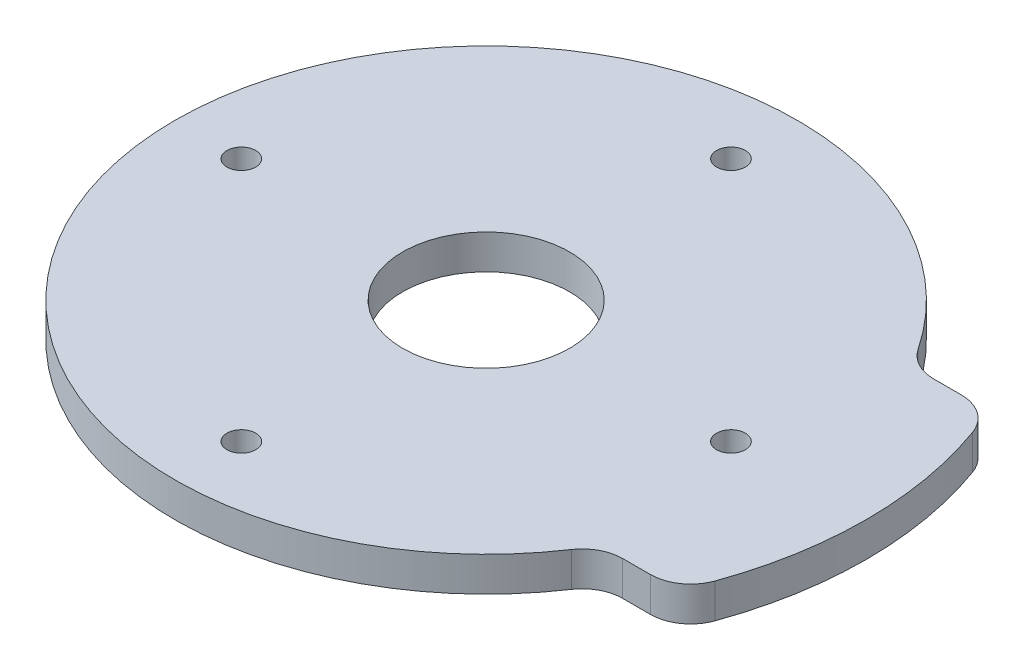
ISO-10303-21;
HEADER;
FILE_DESCRIPTION(('STEP AP214'),'2;1');
FILE_NAME('part.step','',(''),(''),'','','');
FILE_SCHEMA(('AUTOMOTIVE_DESIGN { 1 0 10303 214 1 1 1 1 }'));
ENDSEC;
DATA;
#1=APPLICATION_CONTEXT('core data for automotive mechanical design processes');
#2=APPLICATION_PROTOCOL_DEFINITION('international standard','automotive_design',2000,#1);
#3=PRODUCT_CONTEXT('',#1,'mechanical');
#4=PRODUCT('Part','Part','',(#3));
#5=PRODUCT_RELATED_PRODUCT_CATEGORY('part','',(#4));
#6=PRODUCT_DEFINITION_FORMATION('','',#4);
#7=PRODUCT_DEFINITION_CONTEXT('part definition',#1,'design');
#8=PRODUCT_DEFINITION('design','',#6,#7);
#9=PRODUCT_DEFINITION_SHAPE('','',#8);
#10=(LENGTH_UNIT() NAMED_UNIT(*) SI_UNIT(.MILLI.,.METRE.));
#11=(NAMED_UNIT(*) PLANE_ANGLE_UNIT() SI_UNIT($,.RADIAN.));
#12=(NAMED_UNIT(*) SI_UNIT($,.STERADIAN.) SOLID_ANGLE_UNIT());
#13=UNCERTAINTY_MEASURE_WITH_UNIT(LENGTH_MEASURE(1.E-05),#10,'distance_accuracy_value','');
#14=(GEOMETRIC_REPRESENTATION_CONTEXT(3) GLOBAL_UNCERTAINTY_ASSIGNED_CONTEXT((#13)) GLOBAL_UNIT_ASSIGNED_CONTEXT((#10,
#11,#12)) REPRESENTATION_CONTEXT('',''));
#15=CARTESIAN_POINT('',(0.,0.,0.));
#16=DIRECTION('',(0.,0.,1.));
#17=DIRECTION('',(1.,0.,0.));
#18=AXIS2_PLACEMENT_3D('',#15,#16,#17);
#19=CARTESIAN_POINT('',(0.,6.,0.));
#20=DIRECTION('',(0.,1.,0.));
#21=DIRECTION('',(0.,0.,1.));
#22=AXIS2_PLACEMENT_3D('',#19,#20,#21);
#23=PLANE('',#22);
#24=CARTESIAN_POINT('',(42.5,6.,0.));
#25=DIRECTION('',(0.,1.,0.));
#26=DIRECTION('',(0.,0.,1.));
#27=AXIS2_PLACEMENT_3D('',#24,#25,#26);
#28=CIRCLE('',#27,2.5);
#29=CARTESIAN_POINT('',(42.5,6.,2.5));
#30=VERTEX_POINT('',#29);
#31=EDGE_CURVE('E146',#30,#30,#28,.T.);
#32=ORIENTED_EDGE('',*,*,#31,.F.);
#33=EDGE_LOOP('',(#32));
#34=FACE_BOUND('',#33,.T.);
#35=CARTESIAN_POINT('',(-42.5,6.,0.));
#36=DIRECTION('',(0.,1.,0.));
#37=DIRECTION('',(0.,0.,1.));
#38=AXIS2_PLACEMENT_3D('',#35,#36,#37);
#39=CIRCLE('',#38,2.5);
#40=CARTESIAN_POINT('',(-42.5,6.,2.5));
#41=VERTEX_POINT('',#40);
#42=EDGE_CURVE('E143',#41,#41,#39,.T.);
#43=ORIENTED_EDGE('',*,*,#42,.F.);
#44=EDGE_LOOP('',(#43));
#45=FACE_BOUND('',#44,.T.);
#46=CARTESIAN_POINT('',(0.,6.,42.5));
#47=DIRECTION('',(0.,1.,0.));
#48=DIRECTION('',(0.,0.,1.));
#49=AXIS2_PLACEMENT_3D('',#46,#47,#48);
#50=CIRCLE('',#49,2.5);
#51=CARTESIAN_POINT('',(0.,6.,45.));
#52=VERTEX_POINT('',#51);
#53=EDGE_CURVE('E139',#52,#52,#50,.T.);
#54=ORIENTED_EDGE('',*,*,#53,.F.);
#55=EDGE_LOOP('',(#54));
#56=FACE_BOUND('',#55,.T.);
#57=CARTESIAN_POINT('',(0.,6.,-42.5));
#58=DIRECTION('',(0.,1.,0.));
#59=DIRECTION('',(0.,0.,1.));
#60=AXIS2_PLACEMENT_3D('',#57,#58,#59);
#61=CIRCLE('',#60,2.5);
#62=CARTESIAN_POINT('',(0.,6.,-40.));
#63=VERTEX_POINT('',#62);
#64=EDGE_CURVE('E135',#63,#63,#61,.T.);
#65=ORIENTED_EDGE('',*,*,#64,.F.);
#66=EDGE_LOOP('',(#65));
#67=FACE_BOUND('',#66,.T.);
#68=CARTESIAN_POINT('',(0.,6.,0.));
#69=DIRECTION('',(0.,1.,0.));
#70=DIRECTION('',(0.,0.,1.));
#71=AXIS2_PLACEMENT_3D('',#68,#69,#70);
#72=CIRCLE('',#71,66.);
#73=CARTESIAN_POINT('',(62.0923037085385,6.,22.3728813559322));
#74=VERTEX_POINT('',#73);
#75=CARTESIAN_POINT('',(62.0923037085385,6.,-22.3728813559322));
#76=VERTEX_POINT('',#75);
#77=EDGE_CURVE('E184',#74,#76,#72,.T.);
#78=ORIENTED_EDGE('',*,*,#77,.T.);
#79=CARTESIAN_POINT('',(55.5067563455117,6.,-20.));
#80=DIRECTION('',(0.,1.,0.));
#81=DIRECTION('',(0.,0.,1.));
#82=AXIS2_PLACEMENT_3D('',#79,#80,#81);
#83=CIRCLE('',#82,7.);
#84=CARTESIAN_POINT('',(55.5067563455117,6.,-27.));
#85=VERTEX_POINT('',#84);
#86=EDGE_CURVE('E155',#76,#85,#83,.T.);
#87=ORIENTED_EDGE('',*,*,#86,.T.);
#88=DIRECTION('',(-1.,0.,0.));
#89=VECTOR('',#88,1.);
#90=CARTESIAN_POINT('',(60.2245796996542,6.,-27.));
#91=LINE('',#90,#89);
#92=CARTESIAN_POINT('',(50.7060400741371,6.,-27.));
#93=VERTEX_POINT('',#92);
#94=EDGE_CURVE('E116',#85,#93,#91,.T.);
#95=ORIENTED_EDGE('',*,*,#94,.T.);
#96=CARTESIAN_POINT('',(50.7060400741371,6.,-34.));
#97=DIRECTION('',(0.,1.,0.));
#98=DIRECTION('',(0.,0.,1.));
#99=AXIS2_PLACEMENT_3D('',#96,#97,#98);
#100=CIRCLE('',#99,7.);
#101=CARTESIAN_POINT('',(44.8920797052762,6.,-30.1015561015561));
#102=VERTEX_POINT('',#101);
#103=EDGE_CURVE('E170',#93,#102,#100,.F.);
#104=ORIENTED_EDGE('',*,*,#103,.T.);
#105=CARTESIAN_POINT('',(0.,6.,0.));
#106=DIRECTION('',(0.,1.,0.));
#107=DIRECTION('',(0.,0.,1.));
#108=AXIS2_PLACEMENT_3D('',#105,#106,#107);
#109=CIRCLE('',#108,54.05);
#110=CARTESIAN_POINT('',(44.8920797052762,6.,30.1015561015561));
#111=VERTEX_POINT('',#110);
#112=EDGE_CURVE('E122',#102,#111,#109,.T.);
#113=ORIENTED_EDGE('',*,*,#112,.T.);
#114=CARTESIAN_POINT('',(50.7060400741371,6.,34.));
#115=DIRECTION('',(0.,1.,0.));
#116=DIRECTION('',(0.,0.,1.));
#117=AXIS2_PLACEMENT_3D('',#114,#115,#116);
#118=CIRCLE('',#117,7.);
#119=CARTESIAN_POINT('',(50.7060400741371,6.,27.));
#120=VERTEX_POINT('',#119);
#121=EDGE_CURVE('E11',#111,#120,#118,.F.);
#122=ORIENTED_EDGE('',*,*,#121,.T.);
#123=DIRECTION('',(1.,0.,0.));
#124=VECTOR('',#123,1.);
#125=CARTESIAN_POINT('',(60.2245796996542,6.,27.));
#126=LINE('',#125,#124);
#127=CARTESIAN_POINT('',(55.5067563455117,6.,27.));
#128=VERTEX_POINT('',#127);
#129=EDGE_CURVE('E125',#120,#128,#126,.T.);
#130=ORIENTED_EDGE('',*,*,#129,.T.);
#131=CARTESIAN_POINT('',(55.5067563455117,6.,20.));
#132=DIRECTION('',(0.,1.,0.));
#133=DIRECTION('',(0.,0.,1.));
#134=AXIS2_PLACEMENT_3D('',#131,#132,#133);
#135=CIRCLE('',#134,7.);
#136=EDGE_CURVE('E153',#128,#74,#135,.T.);
#137=ORIENTED_EDGE('',*,*,#136,.T.);
#138=EDGE_LOOP('',(#78,#87,#95,#104,#113,#122,#130,#137));
#139=FACE_BOUND('',#138,.T.);
#140=CARTESIAN_POINT('',(0.,6.,0.));
#141=DIRECTION('',(0.,1.,0.));
#142=DIRECTION('',(0.,0.,1.));
#143=AXIS2_PLACEMENT_3D('',#140,#141,#142);
#144=CIRCLE('',#143,14.5);
#145=CARTESIAN_POINT('',(0.,6.,14.5));
#146=VERTEX_POINT('',#145);
#147=EDGE_CURVE('E178',#146,#146,#144,.T.);
#148=ORIENTED_EDGE('',*,*,#147,.F.);
#149=EDGE_LOOP('',(#148));
#150=FACE_BOUND('',#149,.T.);
#151=ADVANCED_FACE('F32',(#34,#45,#56,#67,#139,#150),#23,.T.);
#152=CARTESIAN_POINT('',(0.,0.,0.));
#153=DIRECTION('',(0.,1.,0.));
#154=DIRECTION('',(0.,0.,1.));
#155=AXIS2_PLACEMENT_3D('',#152,#153,#154);
#156=PLANE('',#155);
#157=CARTESIAN_POINT('',(42.5,0.,0.));
#158=DIRECTION('',(0.,1.,0.));
#159=DIRECTION('',(0.,0.,1.));
#160=AXIS2_PLACEMENT_3D('',#157,#158,#159);
#161=CIRCLE('',#160,2.5);
#162=CARTESIAN_POINT('',(42.5,0.,2.5));
#163=VERTEX_POINT('',#162);
#164=EDGE_CURVE('E144',#163,#163,#161,.T.);
#165=ORIENTED_EDGE('',*,*,#164,.T.);
#166=EDGE_LOOP('',(#165));
#167=FACE_BOUND('',#166,.T.);
#168=CARTESIAN_POINT('',(-42.5,0.,0.));
#169=DIRECTION('',(0.,1.,0.));
#170=DIRECTION('',(0.,0.,1.));
#171=AXIS2_PLACEMENT_3D('',#168,#169,#170);
#172=CIRCLE('',#171,2.5);
#173=CARTESIAN_POINT('',(-42.5,0.,2.5));
#174=VERTEX_POINT('',#173);
#175=EDGE_CURVE('E140',#174,#174,#172,.T.);
#176=ORIENTED_EDGE('',*,*,#175,.T.);
#177=EDGE_LOOP('',(#176));
#178=FACE_BOUND('',#177,.T.);
#179=CARTESIAN_POINT('',(0.,0.,42.5));
#180=DIRECTION('',(0.,1.,0.));
#181=DIRECTION('',(0.,0.,1.));
#182=AXIS2_PLACEMENT_3D('',#179,#180,#181);
#183=CIRCLE('',#182,2.5);
#184=CARTESIAN_POINT('',(0.,0.,45.));
#185=VERTEX_POINT('',#184);
#186=EDGE_CURVE('E136',#185,#185,#183,.T.);
#187=ORIENTED_EDGE('',*,*,#186,.T.);
#188=EDGE_LOOP('',(#187));
#189=FACE_BOUND('',#188,.T.);
#190=CARTESIAN_POINT('',(0.,0.,-42.5));
#191=DIRECTION('',(0.,1.,0.));
#192=DIRECTION('',(0.,0.,1.));
#193=AXIS2_PLACEMENT_3D('',#190,#191,#192);
#194=CIRCLE('',#193,2.5);
#195=CARTESIAN_POINT('',(0.,0.,-40.));
#196=VERTEX_POINT('',#195);
#197=EDGE_CURVE('E131',#196,#196,#194,.T.);
#198=ORIENTED_EDGE('',*,*,#197,.T.);
#199=EDGE_LOOP('',(#198));
#200=FACE_BOUND('',#199,.T.);
#201=DIRECTION('',(-1.,0.,0.));
#202=VECTOR('',#201,1.);
#203=CARTESIAN_POINT('',(60.2245796996542,0.,-27.));
#204=LINE('',#203,#202);
#205=CARTESIAN_POINT('',(55.5067563455117,0.,-27.));
#206=VERTEX_POINT('',#205);
#207=CARTESIAN_POINT('',(50.7060400741371,0.,-27.));
#208=VERTEX_POINT('',#207);
#209=EDGE_CURVE('E113',#206,#208,#204,.T.);
#210=ORIENTED_EDGE('',*,*,#209,.F.);
#211=CARTESIAN_POINT('',(55.5067563455117,0.,-20.));
#212=DIRECTION('',(0.,1.,0.));
#213=DIRECTION('',(0.,0.,1.));
#214=AXIS2_PLACEMENT_3D('',#211,#212,#213);
#215=CIRCLE('',#214,7.);
#216=CARTESIAN_POINT('',(62.0923037085385,0.,-22.3728813559322));
#217=VERTEX_POINT('',#216);
#218=EDGE_CURVE('E96',#206,#217,#215,.F.);
#219=ORIENTED_EDGE('',*,*,#218,.T.);
#220=CARTESIAN_POINT('',(0.,0.,0.));
#221=DIRECTION('',(0.,1.,0.));
#222=DIRECTION('',(0.,0.,1.));
#223=AXIS2_PLACEMENT_3D('',#220,#221,#222);
#224=CIRCLE('',#223,66.);
#225=CARTESIAN_POINT('',(62.0923037085385,0.,22.3728813559322));
#226=VERTEX_POINT('',#225);
#227=EDGE_CURVE('E123',#226,#217,#224,.T.);
#228=ORIENTED_EDGE('',*,*,#227,.F.);
#229=CARTESIAN_POINT('',(55.5067563455117,0.,20.));
#230=DIRECTION('',(0.,1.,0.));
#231=DIRECTION('',(0.,0.,1.));
#232=AXIS2_PLACEMENT_3D('',#229,#230,#231);
#233=CIRCLE('',#232,7.);
#234=CARTESIAN_POINT('',(55.5067563455117,0.,27.));
#235=VERTEX_POINT('',#234);
#236=EDGE_CURVE('E107',#226,#235,#233,.F.);
#237=ORIENTED_EDGE('',*,*,#236,.T.);
#238=DIRECTION('',(1.,0.,0.));
#239=VECTOR('',#238,1.);
#240=CARTESIAN_POINT('',(60.2245796996542,0.,27.));
#241=LINE('',#240,#239);
#242=CARTESIAN_POINT('',(50.7060400741371,0.,27.));
#243=VERTEX_POINT('',#242);
#244=EDGE_CURVE('E127',#243,#235,#241,.T.);
#245=ORIENTED_EDGE('',*,*,#244,.F.);
#246=CARTESIAN_POINT('',(50.7060400741371,0.,34.));
#247=DIRECTION('',(0.,1.,0.));
#248=DIRECTION('',(0.,0.,1.));
#249=AXIS2_PLACEMENT_3D('',#246,#247,#248);
#250=CIRCLE('',#249,7.);
#251=CARTESIAN_POINT('',(44.8920797052762,0.,30.1015561015561));
#252=VERTEX_POINT('',#251);
#253=EDGE_CURVE('E40',#243,#252,#250,.T.);
#254=ORIENTED_EDGE('',*,*,#253,.T.);
#255=CARTESIAN_POINT('',(0.,0.,0.));
#256=DIRECTION('',(0.,1.,0.));
#257=DIRECTION('',(0.,0.,1.));
#258=AXIS2_PLACEMENT_3D('',#255,#256,#257);
#259=CIRCLE('',#258,54.05);
#260=CARTESIAN_POINT('',(44.8920797052762,0.,-30.1015561015561));
#261=VERTEX_POINT('',#260);
#262=EDGE_CURVE('E173',#261,#252,#259,.T.);
#263=ORIENTED_EDGE('',*,*,#262,.F.);
#264=CARTESIAN_POINT('',(50.7060400741371,0.,-34.));
#265=DIRECTION('',(0.,1.,0.));
#266=DIRECTION('',(0.,0.,1.));
#267=AXIS2_PLACEMENT_3D('',#264,#265,#266);
#268=CIRCLE('',#267,7.);
#269=EDGE_CURVE('E121',#261,#208,#268,.T.);
#270=ORIENTED_EDGE('',*,*,#269,.T.);
#271=EDGE_LOOP('',(#210,#219,#228,#237,#245,#254,#263,#270));
#272=FACE_BOUND('',#271,.T.);
#273=CARTESIAN_POINT('',(0.,0.,0.));
#274=DIRECTION('',(0.,1.,0.));
#275=DIRECTION('',(0.,0.,1.));
#276=AXIS2_PLACEMENT_3D('',#273,#274,#275);
#277=CIRCLE('',#276,14.5);
#278=CARTESIAN_POINT('',(0.,0.,14.5));
#279=VERTEX_POINT('',#278);
#280=EDGE_CURVE('E134',#279,#279,#277,.T.);
#281=ORIENTED_EDGE('',*,*,#280,.T.);
#282=EDGE_LOOP('',(#281));
#283=FACE_BOUND('',#282,.T.);
#284=ADVANCED_FACE('F118',(#167,#178,#189,#200,#272,#283),#156,.F.);
#285=CARTESIAN_POINT('',(0.,6.,0.));
#286=DIRECTION('',(0.,-1.,0.));
#287=DIRECTION('',(0.,0.,-1.));
#288=AXIS2_PLACEMENT_3D('',#285,#286,#287);
#289=CYLINDRICAL_SURFACE('',#288,54.05);
#290=ORIENTED_EDGE('',*,*,#112,.F.);
#291=DIRECTION('',(0.,-1.,0.));
#292=VECTOR('',#291,1.);
#293=CARTESIAN_POINT('',(44.8920797052762,6.,-30.1015561015561));
#294=LINE('',#293,#292);
#295=EDGE_CURVE('E162',#102,#261,#294,.T.);
#296=ORIENTED_EDGE('',*,*,#295,.T.);
#297=ORIENTED_EDGE('',*,*,#262,.T.);
#298=DIRECTION('',(0.,-1.,0.));
#299=VECTOR('',#298,1.);
#300=CARTESIAN_POINT('',(44.8920797052762,6.,30.1015561015561));
#301=LINE('',#300,#299);
#302=EDGE_CURVE('E160',#252,#111,#301,.F.);
#303=ORIENTED_EDGE('',*,*,#302,.T.);
#304=EDGE_LOOP('',(#290,#296,#297,#303));
#305=FACE_BOUND('',#304,.T.);
#306=ADVANCED_FACE('F176',(#305),#289,.T.);
#307=CARTESIAN_POINT('',(60.2245796996542,6.,27.));
#308=DIRECTION('',(0.,0.,-1.));
#309=DIRECTION('',(-1.,0.,0.));
#310=AXIS2_PLACEMENT_3D('',#307,#308,#309);
#311=PLANE('',#310);
#312=ORIENTED_EDGE('',*,*,#129,.F.);
#313=DIRECTION('',(0.,1.,0.));
#314=VECTOR('',#313,1.);
#315=CARTESIAN_POINT('',(50.7060400741371,0.,27.));
#316=LINE('',#315,#314);
#317=EDGE_CURVE('E167',#120,#243,#316,.F.);
#318=ORIENTED_EDGE('',*,*,#317,.T.);
#319=ORIENTED_EDGE('',*,*,#244,.T.);
#320=DIRECTION('',(0.,-1.,0.));
#321=VECTOR('',#320,1.);
#322=CARTESIAN_POINT('',(55.5067563455117,6.,27.));
#323=LINE('',#322,#321);
#324=EDGE_CURVE('E157',#235,#128,#323,.F.);
#325=ORIENTED_EDGE('',*,*,#324,.T.);
#326=EDGE_LOOP('',(#312,#318,#319,#325));
#327=FACE_BOUND('',#326,.T.);
#328=ADVANCED_FACE('F181',(#327),#311,.F.);
#329=CARTESIAN_POINT('',(0.,6.,0.));
#330=DIRECTION('',(0.,-1.,0.));
#331=DIRECTION('',(0.,0.,-1.));
#332=AXIS2_PLACEMENT_3D('',#329,#330,#331);
#333=CYLINDRICAL_SURFACE('',#332,66.);
#334=ORIENTED_EDGE('',*,*,#227,.T.);
#335=DIRECTION('',(0.,-1.,0.));
#336=VECTOR('',#335,1.);
#337=CARTESIAN_POINT('',(62.0923037085385,6.,-22.3728813559322));
#338=LINE('',#337,#336);
#339=EDGE_CURVE('E101',#217,#76,#338,.F.);
#340=ORIENTED_EDGE('',*,*,#339,.T.);
#341=ORIENTED_EDGE('',*,*,#77,.F.);
#342=DIRECTION('',(0.,-1.,0.));
#343=VECTOR('',#342,1.);
#344=CARTESIAN_POINT('',(62.0923037085385,6.,22.3728813559322));
#345=LINE('',#344,#343);
#346=EDGE_CURVE('E106',#74,#226,#345,.T.);
#347=ORIENTED_EDGE('',*,*,#346,.T.);
#348=EDGE_LOOP('',(#334,#340,#341,#347));
#349=FACE_BOUND('',#348,.T.);
#350=ADVANCED_FACE('F218',(#349),#333,.T.);
#351=CARTESIAN_POINT('',(60.2245796996542,6.,-27.));
#352=DIRECTION('',(0.,0.,1.));
#353=DIRECTION('',(1.,0.,0.));
#354=AXIS2_PLACEMENT_3D('',#351,#352,#353);
#355=PLANE('',#354);
#356=ORIENTED_EDGE('',*,*,#209,.T.);
#357=DIRECTION('',(0.,1.,0.));
#358=VECTOR('',#357,1.);
#359=CARTESIAN_POINT('',(50.7060400741371,6.,-27.));
#360=LINE('',#359,#358);
#361=EDGE_CURVE('E165',#208,#93,#360,.T.);
#362=ORIENTED_EDGE('',*,*,#361,.T.);
#363=ORIENTED_EDGE('',*,*,#94,.F.);
#364=DIRECTION('',(0.,-1.,0.));
#365=VECTOR('',#364,1.);
#366=CARTESIAN_POINT('',(55.5067563455117,6.,-27.));
#367=LINE('',#366,#365);
#368=EDGE_CURVE('E100',#85,#206,#367,.T.);
#369=ORIENTED_EDGE('',*,*,#368,.T.);
#370=EDGE_LOOP('',(#356,#362,#363,#369));
#371=FACE_BOUND('',#370,.T.);
#372=ADVANCED_FACE('F112',(#371),#355,.F.);
#373=CARTESIAN_POINT('',(0.,6.,0.));
#374=DIRECTION('',(0.,-1.,0.));
#375=DIRECTION('',(0.,0.,-1.));
#376=AXIS2_PLACEMENT_3D('',#373,#374,#375);
#377=CYLINDRICAL_SURFACE('',#376,14.5);
#378=ORIENTED_EDGE('',*,*,#147,.T.);
#379=EDGE_LOOP('',(#378));
#380=FACE_BOUND('',#379,.T.);
#381=ORIENTED_EDGE('',*,*,#280,.F.);
#382=EDGE_LOOP('',(#381));
#383=FACE_BOUND('',#382,.T.);
#384=ADVANCED_FACE('F213',(#380,#383),#377,.F.);
#385=CARTESIAN_POINT('',(0.,-4.,-42.5));
#386=DIRECTION('',(0.,1.,0.));
#387=DIRECTION('',(0.,0.,1.));
#388=AXIS2_PLACEMENT_3D('',#385,#386,#387);
#389=CYLINDRICAL_SURFACE('',#388,2.5);
#390=ORIENTED_EDGE('',*,*,#64,.T.);
#391=EDGE_LOOP('',(#390));
#392=FACE_BOUND('',#391,.T.);
#393=ORIENTED_EDGE('',*,*,#197,.F.);
#394=EDGE_LOOP('',(#393));
#395=FACE_BOUND('',#394,.T.);
#396=ADVANCED_FACE('F244',(#392,#395),#389,.F.);
#397=CARTESIAN_POINT('',(0.,-4.,42.5));
#398=DIRECTION('',(0.,1.,0.));
#399=DIRECTION('',(0.,0.,1.));
#400=AXIS2_PLACEMENT_3D('',#397,#398,#399);
#401=CYLINDRICAL_SURFACE('',#400,2.5);
#402=ORIENTED_EDGE('',*,*,#53,.T.);
#403=EDGE_LOOP('',(#402));
#404=FACE_BOUND('',#403,.T.);
#405=ORIENTED_EDGE('',*,*,#186,.F.);
#406=EDGE_LOOP('',(#405));
#407=FACE_BOUND('',#406,.T.);
#408=ADVANCED_FACE('F237',(#404,#407),#401,.F.);
#409=CARTESIAN_POINT('',(-42.5,-4.,0.));
#410=DIRECTION('',(0.,1.,0.));
#411=DIRECTION('',(0.,0.,1.));
#412=AXIS2_PLACEMENT_3D('',#409,#410,#411);
#413=CYLINDRICAL_SURFACE('',#412,2.5);
#414=ORIENTED_EDGE('',*,*,#42,.T.);
#415=EDGE_LOOP('',(#414));
#416=FACE_BOUND('',#415,.T.);
#417=ORIENTED_EDGE('',*,*,#175,.F.);
#418=EDGE_LOOP('',(#417));
#419=FACE_BOUND('',#418,.T.);
#420=ADVANCED_FACE('F231',(#416,#419),#413,.F.);
#421=CARTESIAN_POINT('',(42.5,-4.,0.));
#422=DIRECTION('',(0.,1.,0.));
#423=DIRECTION('',(0.,0.,1.));
#424=AXIS2_PLACEMENT_3D('',#421,#422,#423);
#425=CYLINDRICAL_SURFACE('',#424,2.5);
#426=ORIENTED_EDGE('',*,*,#31,.T.);
#427=EDGE_LOOP('',(#426));
#428=FACE_BOUND('',#427,.T.);
#429=ORIENTED_EDGE('',*,*,#164,.F.);
#430=EDGE_LOOP('',(#429));
#431=FACE_BOUND('',#430,.T.);
#432=ADVANCED_FACE('F227',(#428,#431),#425,.F.);
#433=CARTESIAN_POINT('',(55.5067563455117,6.,-20.));
#434=DIRECTION('',(0.,-1.,0.));
#435=DIRECTION('',(0.,0.,-1.));
#436=AXIS2_PLACEMENT_3D('',#433,#434,#435);
#437=CYLINDRICAL_SURFACE('',#436,7.);
#438=ORIENTED_EDGE('',*,*,#86,.F.);
#439=ORIENTED_EDGE('',*,*,#339,.F.);
#440=ORIENTED_EDGE('',*,*,#218,.F.);
#441=ORIENTED_EDGE('',*,*,#368,.F.);
#442=EDGE_LOOP('',(#438,#439,#440,#441));
#443=FACE_BOUND('',#442,.T.);
#444=ADVANCED_FACE('F99',(#443),#437,.T.);
#445=CARTESIAN_POINT('',(55.5067563455117,6.,20.));
#446=DIRECTION('',(0.,-1.,0.));
#447=DIRECTION('',(0.,0.,-1.));
#448=AXIS2_PLACEMENT_3D('',#445,#446,#447);
#449=CYLINDRICAL_SURFACE('',#448,7.);
#450=ORIENTED_EDGE('',*,*,#136,.F.);
#451=ORIENTED_EDGE('',*,*,#324,.F.);
#452=ORIENTED_EDGE('',*,*,#236,.F.);
#453=ORIENTED_EDGE('',*,*,#346,.F.);
#454=EDGE_LOOP('',(#450,#451,#452,#453));
#455=FACE_BOUND('',#454,.T.);
#456=ADVANCED_FACE('F195',(#455),#449,.T.);
#457=CARTESIAN_POINT('',(50.7060400741371,6.,-34.));
#458=DIRECTION('',(0.,-1.,0.));
#459=DIRECTION('',(0.,0.,-1.));
#460=AXIS2_PLACEMENT_3D('',#457,#458,#459);
#461=CYLINDRICAL_SURFACE('',#460,7.);
#462=ORIENTED_EDGE('',*,*,#103,.F.);
#463=ORIENTED_EDGE('',*,*,#361,.F.);
#464=ORIENTED_EDGE('',*,*,#269,.F.);
#465=ORIENTED_EDGE('',*,*,#295,.F.);
#466=EDGE_LOOP('',(#462,#463,#464,#465));
#467=FACE_BOUND('',#466,.T.);
#468=ADVANCED_FACE('F193',(#467),#461,.F.);
#469=CARTESIAN_POINT('',(50.7060400741371,6.,34.));
#470=DIRECTION('',(0.,-1.,0.));
#471=DIRECTION('',(0.,0.,-1.));
#472=AXIS2_PLACEMENT_3D('',#469,#470,#471);
#473=CYLINDRICAL_SURFACE('',#472,7.);
#474=ORIENTED_EDGE('',*,*,#121,.F.);
#475=ORIENTED_EDGE('',*,*,#302,.F.);
#476=ORIENTED_EDGE('',*,*,#253,.F.);
#477=ORIENTED_EDGE('',*,*,#317,.F.);
#478=EDGE_LOOP('',(#474,#475,#476,#477));
#479=FACE_BOUND('',#478,.T.);
#480=ADVANCED_FACE('F34',(#479),#473,.F.);
#481=CLOSED_SHELL('',(#151,#284,#306,#328,#350,#372,#384,#396,#408,#420,#432,#444,#456,#468,#480));
#482=MANIFOLD_SOLID_BREP('B2',#481);
#483=ADVANCED_BREP_SHAPE_REPRESENTATION('',(#18,#482),#14);
#484=SHAPE_DEFINITION_REPRESENTATION(#9,#483);
ENDSEC;
END-ISO-10303-21;
